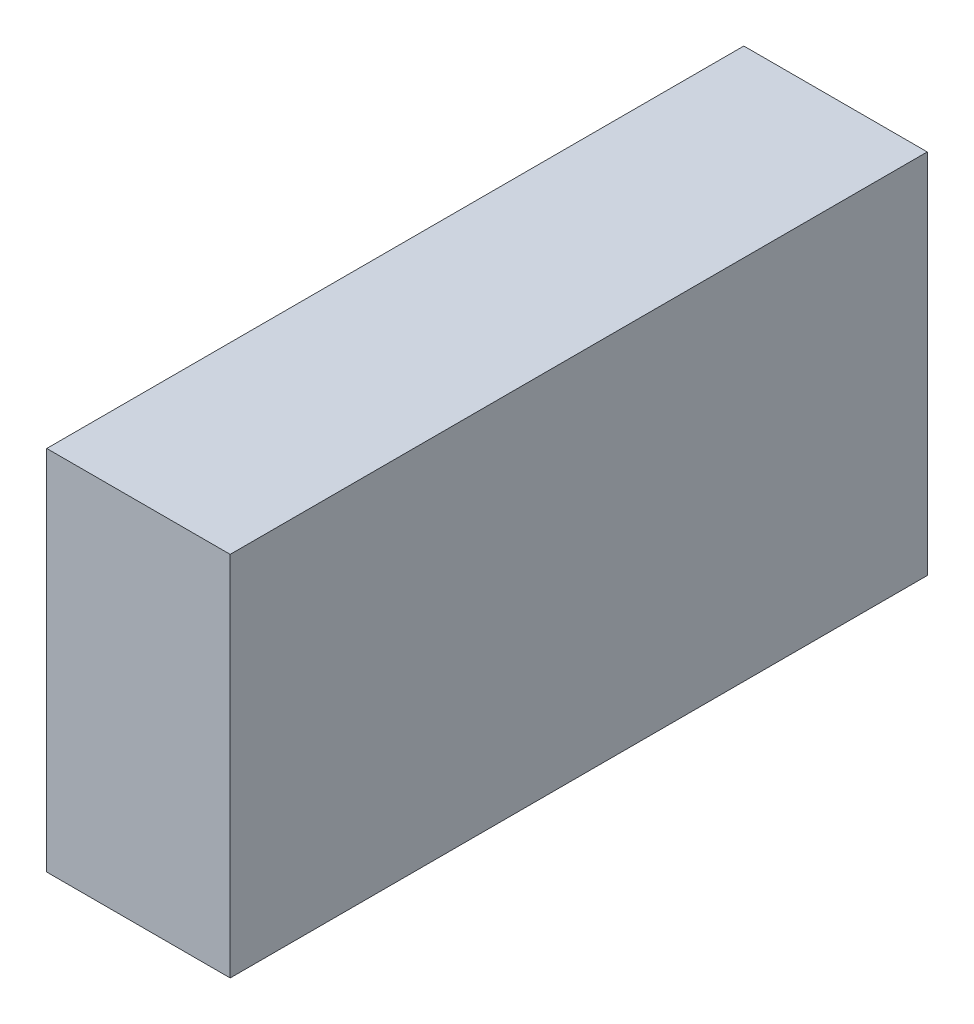
ISO-10303-21;
HEADER;
FILE_DESCRIPTION(('STEP AP214'),'2;1');
FILE_NAME('part.step','',(''),(''),'','','');
FILE_SCHEMA(('AUTOMOTIVE_DESIGN { 1 0 10303 214 1 1 1 1 }'));
ENDSEC;
DATA;
#1=APPLICATION_CONTEXT('core data for automotive mechanical design processes');
#2=APPLICATION_PROTOCOL_DEFINITION('international standard','automotive_design',2000,#1);
#3=PRODUCT_CONTEXT('',#1,'mechanical');
#4=PRODUCT('Part','Part','',(#3));
#5=PRODUCT_RELATED_PRODUCT_CATEGORY('part','',(#4));
#6=PRODUCT_DEFINITION_FORMATION('','',#4);
#7=PRODUCT_DEFINITION_CONTEXT('part definition',#1,'design');
#8=PRODUCT_DEFINITION('design','',#6,#7);
#9=PRODUCT_DEFINITION_SHAPE('','',#8);
#10=(LENGTH_UNIT() NAMED_UNIT(*) SI_UNIT(.MILLI.,.METRE.));
#11=(NAMED_UNIT(*) PLANE_ANGLE_UNIT() SI_UNIT($,.RADIAN.));
#12=(NAMED_UNIT(*) SI_UNIT($,.STERADIAN.) SOLID_ANGLE_UNIT());
#13=UNCERTAINTY_MEASURE_WITH_UNIT(LENGTH_MEASURE(1.E-05),#10,'distance_accuracy_value','');
#14=(GEOMETRIC_REPRESENTATION_CONTEXT(3) GLOBAL_UNCERTAINTY_ASSIGNED_CONTEXT((#13)) GLOBAL_UNIT_ASSIGNED_CONTEXT((#10,
#11,#12)) REPRESENTATION_CONTEXT('',''));
#15=CARTESIAN_POINT('',(0.,0.,0.));
#16=DIRECTION('',(0.,0.,1.));
#17=DIRECTION('',(1.,0.,0.));
#18=AXIS2_PLACEMENT_3D('',#15,#16,#17);
#19=CARTESIAN_POINT('',(12.7,0.,0.));
#20=DIRECTION('',(0.,0.,-1.));
#21=DIRECTION('',(-1.,0.,0.));
#22=AXIS2_PLACEMENT_3D('',#19,#20,#21);
#23=PLANE('',#22);
#24=DIRECTION('',(0.,-1.,0.));
#25=VECTOR('',#24,1.);
#26=CARTESIAN_POINT('',(0.,0.,0.));
#27=LINE('',#26,#25);
#28=CARTESIAN_POINT('',(0.,25.4,0.));
#29=VERTEX_POINT('',#28);
#30=CARTESIAN_POINT('',(0.,0.,0.));
#31=VERTEX_POINT('',#30);
#32=EDGE_CURVE('E107',#29,#31,#27,.T.);
#33=ORIENTED_EDGE('',*,*,#32,.T.);
#34=DIRECTION('',(-1.,0.,0.));
#35=VECTOR('',#34,1.);
#36=CARTESIAN_POINT('',(12.7,0.,0.));
#37=LINE('',#36,#35);
#38=CARTESIAN_POINT('',(12.7,0.,0.));
#39=VERTEX_POINT('',#38);
#40=EDGE_CURVE('E11',#39,#31,#37,.T.);
#41=ORIENTED_EDGE('',*,*,#40,.F.);
#42=DIRECTION('',(0.,-1.,0.));
#43=VECTOR('',#42,1.);
#44=CARTESIAN_POINT('',(12.7,0.,0.));
#45=LINE('',#44,#43);
#46=CARTESIAN_POINT('',(12.7,25.4,0.));
#47=VERTEX_POINT('',#46);
#48=EDGE_CURVE('E91',#47,#39,#45,.T.);
#49=ORIENTED_EDGE('',*,*,#48,.F.);
#50=DIRECTION('',(-1.,0.,0.));
#51=VECTOR('',#50,1.);
#52=CARTESIAN_POINT('',(12.7,25.4,0.));
#53=LINE('',#52,#51);
#54=EDGE_CURVE('E103',#47,#29,#53,.T.);
#55=ORIENTED_EDGE('',*,*,#54,.T.);
#56=EDGE_LOOP('',(#33,#41,#49,#55));
#57=FACE_BOUND('',#56,.T.);
#58=ADVANCED_FACE('F39',(#57),#23,.F.);
#59=CARTESIAN_POINT('',(12.7,0.,0.));
#60=DIRECTION('',(0.,1.,0.));
#61=DIRECTION('',(0.,0.,1.));
#62=AXIS2_PLACEMENT_3D('',#59,#60,#61);
#63=PLANE('',#62);
#64=DIRECTION('',(0.,0.,-1.));
#65=VECTOR('',#64,1.);
#66=CARTESIAN_POINT('',(0.,0.,0.));
#67=LINE('',#66,#65);
#68=CARTESIAN_POINT('',(0.,0.,-48.26));
#69=VERTEX_POINT('',#68);
#70=EDGE_CURVE('E96',#31,#69,#67,.T.);
#71=ORIENTED_EDGE('',*,*,#70,.T.);
#72=DIRECTION('',(-1.,0.,0.));
#73=VECTOR('',#72,1.);
#74=CARTESIAN_POINT('',(12.7,0.,-48.26));
#75=LINE('',#74,#73);
#76=CARTESIAN_POINT('',(12.7,0.,-48.26));
#77=VERTEX_POINT('',#76);
#78=EDGE_CURVE('E48',#77,#69,#75,.T.);
#79=ORIENTED_EDGE('',*,*,#78,.F.);
#80=DIRECTION('',(0.,0.,-1.));
#81=VECTOR('',#80,1.);
#82=CARTESIAN_POINT('',(12.7,0.,0.));
#83=LINE('',#82,#81);
#84=EDGE_CURVE('E86',#39,#77,#83,.T.);
#85=ORIENTED_EDGE('',*,*,#84,.F.);
#86=ORIENTED_EDGE('',*,*,#40,.T.);
#87=EDGE_LOOP('',(#71,#79,#85,#86));
#88=FACE_BOUND('',#87,.T.);
#89=ADVANCED_FACE('F95',(#88),#63,.F.);
#90=CARTESIAN_POINT('',(12.7,0.,-48.26));
#91=DIRECTION('',(0.,0.,1.));
#92=DIRECTION('',(1.,0.,0.));
#93=AXIS2_PLACEMENT_3D('',#90,#91,#92);
#94=PLANE('',#93);
#95=DIRECTION('',(0.,1.,0.));
#96=VECTOR('',#95,1.);
#97=CARTESIAN_POINT('',(0.,0.,-48.26));
#98=LINE('',#97,#96);
#99=CARTESIAN_POINT('',(0.,25.4,-48.26));
#100=VERTEX_POINT('',#99);
#101=EDGE_CURVE('E73',#69,#100,#98,.T.);
#102=ORIENTED_EDGE('',*,*,#101,.T.);
#103=DIRECTION('',(-1.,0.,0.));
#104=VECTOR('',#103,1.);
#105=CARTESIAN_POINT('',(12.7,25.4,-48.26));
#106=LINE('',#105,#104);
#107=CARTESIAN_POINT('',(12.7,25.4,-48.26));
#108=VERTEX_POINT('',#107);
#109=EDGE_CURVE('E98',#108,#100,#106,.T.);
#110=ORIENTED_EDGE('',*,*,#109,.F.);
#111=DIRECTION('',(0.,1.,0.));
#112=VECTOR('',#111,1.);
#113=CARTESIAN_POINT('',(12.7,0.,-48.26));
#114=LINE('',#113,#112);
#115=EDGE_CURVE('E89',#77,#108,#114,.T.);
#116=ORIENTED_EDGE('',*,*,#115,.F.);
#117=ORIENTED_EDGE('',*,*,#78,.T.);
#118=EDGE_LOOP('',(#102,#110,#116,#117));
#119=FACE_BOUND('',#118,.T.);
#120=ADVANCED_FACE('F99',(#119),#94,.F.);
#121=CARTESIAN_POINT('',(12.7,25.4,0.));
#122=DIRECTION('',(0.,-1.,0.));
#123=DIRECTION('',(0.,0.,-1.));
#124=AXIS2_PLACEMENT_3D('',#121,#122,#123);
#125=PLANE('',#124);
#126=DIRECTION('',(0.,0.,1.));
#127=VECTOR('',#126,1.);
#128=CARTESIAN_POINT('',(0.,25.4,0.));
#129=LINE('',#128,#127);
#130=EDGE_CURVE('E79',#100,#29,#129,.T.);
#131=ORIENTED_EDGE('',*,*,#130,.T.);
#132=ORIENTED_EDGE('',*,*,#54,.F.);
#133=DIRECTION('',(0.,0.,1.));
#134=VECTOR('',#133,1.);
#135=CARTESIAN_POINT('',(12.7,25.4,0.));
#136=LINE('',#135,#134);
#137=EDGE_CURVE('E56',#108,#47,#136,.T.);
#138=ORIENTED_EDGE('',*,*,#137,.F.);
#139=ORIENTED_EDGE('',*,*,#109,.T.);
#140=EDGE_LOOP('',(#131,#132,#138,#139));
#141=FACE_BOUND('',#140,.T.);
#142=ADVANCED_FACE('F120',(#141),#125,.F.);
#143=CARTESIAN_POINT('',(12.7,0.,0.));
#144=DIRECTION('',(-1.,0.,0.));
#145=DIRECTION('',(0.,0.,1.));
#146=AXIS2_PLACEMENT_3D('',#143,#144,#145);
#147=PLANE('',#146);
#148=ORIENTED_EDGE('',*,*,#48,.T.);
#149=ORIENTED_EDGE('',*,*,#84,.T.);
#150=ORIENTED_EDGE('',*,*,#115,.T.);
#151=ORIENTED_EDGE('',*,*,#137,.T.);
#152=EDGE_LOOP('',(#148,#149,#150,#151));
#153=FACE_BOUND('',#152,.T.);
#154=ADVANCED_FACE('F87',(#153),#147,.F.);
#155=CARTESIAN_POINT('',(0.,0.,0.));
#156=DIRECTION('',(-1.,0.,0.));
#157=DIRECTION('',(0.,0.,1.));
#158=AXIS2_PLACEMENT_3D('',#155,#156,#157);
#159=PLANE('',#158);
#160=ORIENTED_EDGE('',*,*,#32,.F.);
#161=ORIENTED_EDGE('',*,*,#130,.F.);
#162=ORIENTED_EDGE('',*,*,#101,.F.);
#163=ORIENTED_EDGE('',*,*,#70,.F.);
#164=EDGE_LOOP('',(#160,#161,#162,#163));
#165=FACE_BOUND('',#164,.T.);
#166=ADVANCED_FACE('F123',(#165),#159,.T.);
#167=CLOSED_SHELL('',(#58,#89,#120,#142,#154,#166));
#168=MANIFOLD_SOLID_BREP('B2',#167);
#169=ADVANCED_BREP_SHAPE_REPRESENTATION('',(#18,#168),#14);
#170=SHAPE_DEFINITION_REPRESENTATION(#9,#169);
ENDSEC;
END-ISO-10303-21;
